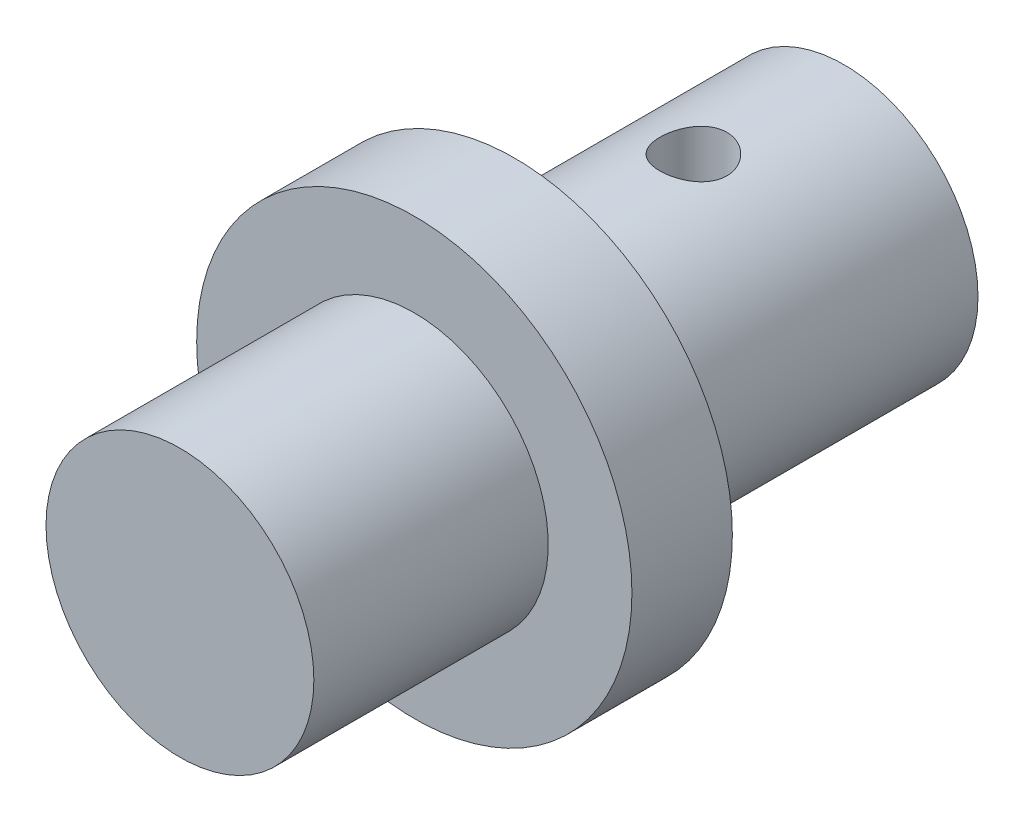
ISO-10303-21;
HEADER;
FILE_DESCRIPTION(('STEP AP214'),'2;1');
FILE_NAME('part.step','',(''),(''),'','','');
FILE_SCHEMA(('AUTOMOTIVE_DESIGN { 1 0 10303 214 1 1 1 1 }'));
ENDSEC;
DATA;
#1=APPLICATION_CONTEXT('core data for automotive mechanical design processes');
#2=APPLICATION_PROTOCOL_DEFINITION('international standard','automotive_design',2000,#1);
#3=PRODUCT_CONTEXT('',#1,'mechanical');
#4=PRODUCT('Part','Part','',(#3));
#5=PRODUCT_RELATED_PRODUCT_CATEGORY('part','',(#4));
#6=PRODUCT_DEFINITION_FORMATION('','',#4);
#7=PRODUCT_DEFINITION_CONTEXT('part definition',#1,'design');
#8=PRODUCT_DEFINITION('design','',#6,#7);
#9=PRODUCT_DEFINITION_SHAPE('','',#8);
#10=(LENGTH_UNIT() NAMED_UNIT(*) SI_UNIT(.MILLI.,.METRE.));
#11=(NAMED_UNIT(*) PLANE_ANGLE_UNIT() SI_UNIT($,.RADIAN.));
#12=(NAMED_UNIT(*) SI_UNIT($,.STERADIAN.) SOLID_ANGLE_UNIT());
#13=UNCERTAINTY_MEASURE_WITH_UNIT(LENGTH_MEASURE(1.E-05),#10,'distance_accuracy_value','');
#14=(GEOMETRIC_REPRESENTATION_CONTEXT(3) GLOBAL_UNCERTAINTY_ASSIGNED_CONTEXT((#13)) GLOBAL_UNIT_ASSIGNED_CONTEXT((#10,
#11,#12)) REPRESENTATION_CONTEXT('',''));
#15=CARTESIAN_POINT('',(0.,0.,0.));
#16=DIRECTION('',(0.,0.,1.));
#17=DIRECTION('',(1.,0.,0.));
#18=AXIS2_PLACEMENT_3D('',#15,#16,#17);
#19=CARTESIAN_POINT('',(0.,4.,4.5));
#20=DIRECTION('',(0.,-1.,0.));
#21=DIRECTION('',(0.,0.,-1.));
#22=AXIS2_PLACEMENT_3D('',#19,#20,#21);
#23=CYLINDRICAL_SURFACE('',#22,1.);
#24=CARTESIAN_POINT('',(0.,4.,3.5));
#25=CARTESIAN_POINT('',(0.0552507257798207,3.99999906578675,3.50000155049211));
#26=CARTESIAN_POINT('',(0.110518771887175,3.99884385421219,3.50459436718253));
#27=CARTESIAN_POINT('',(0.219470882513688,3.99434742553262,3.522816767538));
#28=CARTESIAN_POINT('',(0.273154031247159,3.99100496946646,3.53645147302523));
#29=CARTESIAN_POINT('',(0.377347248121718,3.98250417554693,3.57229283564139));
#30=CARTESIAN_POINT('',(0.427861042286669,3.97734801894725,3.59448919914352));
#31=CARTESIAN_POINT('',(0.524448087936284,3.96576895871729,3.64678759336322));
#32=CARTESIAN_POINT('',(0.570521189565839,3.95934601236034,3.67688989074596));
#33=CARTESIAN_POINT('',(0.657867951533946,3.94578275727868,3.74480052643614));
#34=CARTESIAN_POINT('',(0.69903712670738,3.93863138099022,3.78274104997278));
#35=CARTESIAN_POINT('',(0.774499284802202,3.92449080078353,3.86496813660594));
#36=CARTESIAN_POINT('',(0.808791491299423,3.91750161525566,3.90925541529766));
#37=CARTESIAN_POINT('',(0.870017695199355,3.9043651713314,4.00373015115829));
#38=CARTESIAN_POINT('',(0.896834810616904,3.89823196313737,4.05399548720694));
#39=CARTESIAN_POINT('',(0.941597939033685,3.88766329874815,4.15849894110557));
#40=CARTESIAN_POINT('',(0.959545370292888,3.88322757115193,4.21273642221717));
#41=CARTESIAN_POINT('',(0.985703224536193,3.87666984478367,4.32249566546832));
#42=CARTESIAN_POINT('',(0.994101512222225,3.87450327383617,4.37796993069987));
#43=CARTESIAN_POINT('',(1.00150785004523,3.87259575025161,4.48957904600932));
#44=CARTESIAN_POINT('',(1.00051742787865,3.87285440299096,4.54571378713241));
#45=CARTESIAN_POINT('',(0.98932434975952,3.87572803664412,4.65561053849632));
#46=CARTESIAN_POINT('',(0.979345560127013,3.87828575334586,4.70939708097673));
#47=CARTESIAN_POINT('',(0.950816124602071,3.88537806450989,4.8145073672742));
#48=CARTESIAN_POINT('',(0.932264868046282,3.88991279980464,4.86583093535266));
#49=CARTESIAN_POINT('',(0.886926318624769,3.90050075936124,4.96515867750138));
#50=CARTESIAN_POINT('',(0.860057778155274,3.90656884979614,5.01312411452637));
#51=CARTESIAN_POINT('',(0.798904184009969,3.91953140564257,5.10394580650456));
#52=CARTESIAN_POINT('',(0.764617832539226,3.9264260155649,5.14680116537817));
#53=CARTESIAN_POINT('',(0.688442283120812,3.94050587026521,5.2274690771296));
#54=CARTESIAN_POINT('',(0.646364172110573,3.94769379651981,5.26510299337423));
#55=CARTESIAN_POINT('',(0.556407945002467,3.96137310385857,5.3328141616426));
#56=CARTESIAN_POINT('',(0.508529651805296,3.96786446366277,5.36289118284238));
#57=CARTESIAN_POINT('',(0.408077259120928,3.97945154729455,5.41470039081626));
#58=CARTESIAN_POINT('',(0.355487595472416,3.9845424008515,5.43640356016962));
#59=CARTESIAN_POINT('',(0.247250672095255,3.99271944660946,5.47061153713971));
#60=CARTESIAN_POINT('',(0.191603999433656,3.99580602226187,5.48311810427876));
#61=CARTESIAN_POINT('',(0.0803599802600179,3.9995699951425,5.49830504370589));
#62=CARTESIAN_POINT('',(0.0247978133254731,4.00030702338852,5.5012286840502));
#63=CARTESIAN_POINT('',(-0.0860219165343387,3.99945869876301,5.49783399862967));
#64=CARTESIAN_POINT('',(-0.14127950642973,3.99787355494564,5.49151650480058));
#65=CARTESIAN_POINT('',(-0.249076179184328,3.99259720751571,5.47001939440575));
#66=CARTESIAN_POINT('',(-0.301643412645836,3.98893756123874,5.45497249101534));
#67=CARTESIAN_POINT('',(-0.403504861635007,3.97992471089423,5.41659527731437));
#68=CARTESIAN_POINT('',(-0.452798746021756,3.97457133579928,5.39326413045789));
#69=CARTESIAN_POINT('',(-0.547682089619898,3.96262205284207,5.33850924741685));
#70=CARTESIAN_POINT('',(-0.59319029455722,3.95600578244622,5.30694925840216));
#71=CARTESIAN_POINT('',(-0.678351075762164,3.94229672791613,5.23680672746869));
#72=CARTESIAN_POINT('',(-0.718002639315339,3.93520386167803,5.19822297358873));
#73=CARTESIAN_POINT('',(-0.79132704538182,3.92112637973847,5.11399869277036));
#74=CARTESIAN_POINT('',(-0.824829245081354,3.91414869458187,5.06820819799839));
#75=CARTESIAN_POINT('',(-0.883673839341798,3.90128585584826,4.97151157702286));
#76=CARTESIAN_POINT('',(-0.909016596105291,3.89540065378017,4.92060567802683));
#77=CARTESIAN_POINT('',(-0.950634280406194,3.88545396489777,4.81539618505795));
#78=CARTESIAN_POINT('',(-0.96696293110271,3.88138170194604,4.76111491443733));
#79=CARTESIAN_POINT('',(-0.990230439969186,3.87551162726789,4.65046024140726));
#80=CARTESIAN_POINT('',(-0.997171351652438,3.87371331813291,4.59408729931167));
#81=CARTESIAN_POINT('',(-1.00135906022266,3.87263267469305,4.48258598409653));
#82=CARTESIAN_POINT('',(-0.998878598520078,3.87327955152176,4.42746837658351));
#83=CARTESIAN_POINT('',(-0.984918185541911,3.87685272671895,4.31846407422135));
#84=CARTESIAN_POINT('',(-0.973438415124513,3.87977897927905,4.26457735465757));
#85=CARTESIAN_POINT('',(-0.941954212961863,3.88754173788482,4.15986102728973));
#86=CARTESIAN_POINT('',(-0.922000936453584,3.89236676824206,4.10901512983986));
#87=CARTESIAN_POINT('',(-0.874176609070047,3.90338503816552,4.01135641152421));
#88=CARTESIAN_POINT('',(-0.846304460022792,3.90957846747182,3.96454415120872));
#89=CARTESIAN_POINT('',(-0.782578499091424,3.92283756175675,3.87496358066532));
#90=CARTESIAN_POINT('',(-0.746535441941503,3.92992176554505,3.83233261771736));
#91=CARTESIAN_POINT('',(-0.667859580793157,3.94405351497524,3.75363530346973));
#92=CARTESIAN_POINT('',(-0.625225214174097,3.95110105151373,3.71757051325802));
#93=CARTESIAN_POINT('',(-0.533645057801727,3.96451770431775,3.65239246095693));
#94=CARTESIAN_POINT('',(-0.484598948210925,3.97087222243912,3.62341692421895));
#95=CARTESIAN_POINT('',(-0.382177373006984,3.98203283316746,3.57416835803965));
#96=CARTESIAN_POINT('',(-0.32880504229116,3.98684003466521,3.55388909290098));
#97=CARTESIAN_POINT('',(-0.229606835495648,3.99365373043694,3.52561877978023));
#98=CARTESIAN_POINT('',(-0.184253447272046,3.9960172336846,3.51603250463104));
#99=CARTESIAN_POINT('',(-0.0926040476908553,3.99919070154632,3.50322270425204));
#100=CARTESIAN_POINT('',(-0.0463081074950775,4.00000078300596,3.49999870046313));
#101=CARTESIAN_POINT('',(0.,4.,3.5));
#102=B_SPLINE_CURVE_WITH_KNOTS('',3,(#24,#25,#26,#27,#28,#29,#30,#31,#32,#33,#34,#35,#36,#37,
#38,#39,#40,#41,#42,#43,#44,#45,#46,#47,#48,#49,#50,#51,#52,#53,#54,#55,#56,#57,#58,#59,#60,#61,
#62,#63,#64,#65,#66,#67,#68,#69,#70,#71,#72,#73,#74,#75,#76,#77,#78,#79,#80,#81,#82,#83,#84,#85,
#86,#87,#88,#89,#90,#91,#92,#93,#94,#95,#96,#97,#98,#99,#100,#101),.UNSPECIFIED.,.T.,.F.,(4,2,2,
2,2,2,2,2,2,2,2,2,2,2,2,2,2,2,2,2,2,2,2,2,2,2,2,2,2,2,2,2,2,2,2,2,2,2,4),(0.,0.16558247498126,
0.331258825175933,0.49673660152407,0.662219960112885,0.830762902914259,0.999324863867079,
1.17039098363871,1.34142974112912,1.50904196732954,1.67662692075131,1.84014998004679,
2.00368468977359,2.16887018582586,2.33408460557442,2.50401000646013,2.67394059705498,
2.84445486006076,3.01493649125762,3.18105539299517,3.34715934075162,3.51080183009358,
3.67446084881527,3.84102391710235,4.00761575338679,4.17829672802984,4.34897012499672,
4.51861503076024,4.68822282168272,4.85295853599075,5.01769093970689,5.18144267039631,
5.34521712091267,5.51326384273273,5.68135046513612,5.85248123666392,6.02348909214233,
6.16228161961433,6.3010637069536),.UNSPECIFIED.);
#103=CARTESIAN_POINT('',(0.,4.,3.5));
#104=VERTEX_POINT('',#103);
#105=EDGE_CURVE('E43',#104,#104,#102,.T.);
#106=ORIENTED_EDGE('',*,*,#105,.F.);
#107=EDGE_LOOP('',(#106));
#108=FACE_BOUND('',#107,.T.);
#109=CARTESIAN_POINT('',(0.,-1.41480546000001,4.5));
#110=DIRECTION('',(0.,-1.,0.));
#111=DIRECTION('',(0.,0.,-1.));
#112=AXIS2_PLACEMENT_3D('',#109,#110,#111);
#113=CIRCLE('',#112,1.);
#114=CARTESIAN_POINT('',(0.,-1.41480546000001,3.5));
#115=VERTEX_POINT('',#114);
#116=EDGE_CURVE('E54',#115,#115,#113,.F.);
#117=ORIENTED_EDGE('',*,*,#116,.F.);
#118=EDGE_LOOP('',(#117));
#119=FACE_BOUND('',#118,.T.);
#120=ADVANCED_FACE('F31',(#108,#119),#23,.F.);
#121=CARTESIAN_POINT('',(0.,0.,19.83582727));
#122=DIRECTION('',(0.,0.,-1.));
#123=DIRECTION('',(-1.,0.,0.));
#124=AXIS2_PLACEMENT_3D('',#121,#122,#123);
#125=CYLINDRICAL_SURFACE('',#124,4.);
#126=CARTESIAN_POINT('',(0.,0.,9.8359246));
#127=DIRECTION('',(0.,0.,-1.));
#128=DIRECTION('',(-1.,0.,0.));
#129=AXIS2_PLACEMENT_3D('',#126,#127,#128);
#130=CIRCLE('',#129,4.);
#131=CARTESIAN_POINT('',(-4.,0.,9.8359246));
#132=VERTEX_POINT('',#131);
#133=EDGE_CURVE('E85',#132,#132,#130,.T.);
#134=ORIENTED_EDGE('',*,*,#133,.T.);
#135=EDGE_LOOP('',(#134));
#136=FACE_BOUND('',#135,.T.);
#137=ORIENTED_EDGE('',*,*,#105,.T.);
#138=EDGE_LOOP('',(#137));
#139=FACE_BOUND('',#138,.T.);
#140=CARTESIAN_POINT('',(0.,-4.,2.025));
#141=CARTESIAN_POINT('',(-0.125962527983466,-3.99999087743957,2.02500999117475));
#142=CARTESIAN_POINT('',(-0.252093477389554,-3.99398651152791,2.0346826713579));
#143=CARTESIAN_POINT('',(-0.500503164275012,-3.97053472893242,2.07286410529595));
#144=CARTESIAN_POINT('',(-0.622773463847888,-3.95306385098865,2.10141147883811));
#145=CARTESIAN_POINT('',(-0.859370702824245,-3.9084403936745,2.17569226660762));
#146=CARTESIAN_POINT('',(-0.973733723894938,-3.88133581279877,2.22134053797876));
#147=CARTESIAN_POINT('',(-1.19279008728619,-3.81971441235423,2.32796574414736));
#148=CARTESIAN_POINT('',(-1.29748482045069,-3.78519866131168,2.38894046942637));
#149=CARTESIAN_POINT('',(-1.50359316394966,-3.70840070972002,2.52981547687476));
#150=CARTESIAN_POINT('',(-1.60409343471206,-3.66572028722713,2.61083067728701));
#151=CARTESIAN_POINT('',(-1.79096791104175,-3.57814322130472,2.78693966351467));
#152=CARTESIAN_POINT('',(-1.87732302390648,-3.53324368721205,2.88205215309908));
#153=CARTESIAN_POINT('',(-2.04506363595458,-3.43920352816993,3.09839915716578));
#154=CARTESIAN_POINT('',(-2.12428336464637,-3.39028681581553,3.2214247225928));
#155=CARTESIAN_POINT('',(-2.26067210059697,-3.30091378437148,3.48191121203256));
#156=CARTESIAN_POINT('',(-2.31787803738444,-3.26044334879098,3.61934746386028));
#157=CARTESIAN_POINT('',(-2.39585473139489,-3.20337240494684,3.8691356997232));
#158=CARTESIAN_POINT('',(-2.42219544007388,-3.1833171910417,3.9789548259248));
#159=CARTESIAN_POINT('',(-2.45966467236897,-3.15446174060793,4.20254536292264));
#160=CARTESIAN_POINT('',(-2.47081401370517,-3.14564610282378,4.31631114553434));
#161=CARTESIAN_POINT('',(-2.47723878292226,-3.14059073236661,4.54485948967856));
#162=CARTESIAN_POINT('',(-2.47247541860744,-3.14438173221214,4.65964385464637));
#163=CARTESIAN_POINT('',(-2.44730787139391,-3.16400414319883,4.88646273709323));
#164=CARTESIAN_POINT('',(-2.42689132982624,-3.17984506805208,4.99849500954426));
#165=CARTESIAN_POINT('',(-2.37213044836685,-3.22088858685475,5.21472152758653));
#166=CARTESIAN_POINT('',(-2.33807543860679,-3.24589584332613,5.31902831079517));
#167=CARTESIAN_POINT('',(-2.25735449417097,-3.30254089772638,5.52067920505908));
#168=CARTESIAN_POINT('',(-2.21068406332192,-3.33418105873783,5.61802081803367));
#169=CARTESIAN_POINT('',(-2.09618724882258,-3.4075536569795,5.8220096916399));
#170=CARTESIAN_POINT('',(-2.02604859807342,-3.4500720013296,5.92707594903287));
#171=CARTESIAN_POINT('',(-1.87097625783654,-3.5365722083175,6.12508677574881));
#172=CARTESIAN_POINT('',(-1.78602759503902,-3.58055551531127,6.21801890923623));
#173=CARTESIAN_POINT('',(-1.5878717295625,-3.67320631262343,6.40409400372712));
#174=CARTESIAN_POINT('',(-1.47231994534046,-3.72151331309376,6.49494212146241));
#175=CARTESIAN_POINT('',(-1.22463392606212,-3.81018237230542,6.65583369602293));
#176=CARTESIAN_POINT('',(-1.09250692637344,-3.85054787802005,6.72588618585416));
#177=CARTESIAN_POINT('',(-0.888459599267787,-3.90066898053568,6.81112906855973));
#178=CARTESIAN_POINT('',(-0.821558567010723,-3.91533736056855,6.83576351071682));
#179=CARTESIAN_POINT('',(-0.685323525177254,-3.9414626480525,6.87929814010671));
#180=CARTESIAN_POINT('',(-0.615990935724851,-3.95292139603236,6.89820161421545));
#181=CARTESIAN_POINT('',(-0.475522335069477,-3.97226622387952,6.92995525913055));
#182=CARTESIAN_POINT('',(-0.404387917801591,-3.98015535245198,6.942810595845));
#183=CARTESIAN_POINT('',(-0.260979278185191,-3.99212703659955,6.96226702757636));
#184=CARTESIAN_POINT('',(-0.188705243355633,-3.99621021191558,6.9688691408373));
#185=CARTESIAN_POINT('',(0.00763946573205035,-4.00190143559954,6.97808067068138));
#186=CARTESIAN_POINT('',(0.132185245919001,-3.99971548719424,6.97456216445741));
#187=CARTESIAN_POINT('',(0.378536132806585,-3.98396559799443,6.94902023765427));
#188=CARTESIAN_POINT('',(0.500341388449554,-3.97040227707988,6.92699782523398));
#189=CARTESIAN_POINT('',(0.733654769687328,-3.93385420950478,6.86672428138281));
#190=CARTESIAN_POINT('',(0.845374410705363,-3.9112177702641,6.82907146088568));
#191=CARTESIAN_POINT('',(1.06081280901474,-3.85836717943891,6.73918316087296));
#192=CARTESIAN_POINT('',(1.16453016966602,-3.82815170897843,6.68694514311424));
#193=CARTESIAN_POINT('',(1.37248771563005,-3.75891970655208,6.56348760466114));
#194=CARTESIAN_POINT('',(1.47570454043898,-3.7193201336696,6.49087641916675));
#195=CARTESIAN_POINT('',(1.66922989951576,-3.63658820064071,6.33167343924813));
#196=CARTESIAN_POINT('',(1.75952362643114,-3.5934518756442,6.2450658456942));
#197=CARTESIAN_POINT('',(1.93787932608623,-3.50086864723262,6.04613856720843));
#198=CARTESIAN_POINT('',(2.02381364296441,-3.45139332825516,5.93191452993249));
#199=CARTESIAN_POINT('',(2.17552687073637,-3.35783124116785,5.68877990197333));
#200=CARTESIAN_POINT('',(2.24132174040988,-3.31374022320296,5.55988105152722));
#201=CARTESIAN_POINT('',(2.33866031431269,-3.24552450103664,5.31820954206094));
#202=CARTESIAN_POINT('',(2.37450880315115,-3.21914844080678,5.20781513777796));
#203=CARTESIAN_POINT('',(2.43055921939533,-3.17704740009971,4.98122708806866));
#204=CARTESIAN_POINT('',(2.45078500797716,-3.16130618123091,4.86504257621622));
#205=CARTESIAN_POINT('',(2.47447017579692,-3.14280847463082,4.62928686080161));
#206=CARTESIAN_POINT('',(2.47784252968112,-3.14011938566789,4.50970127898103));
#207=CARTESIAN_POINT('',(2.46733028166308,-3.14838328658991,4.27174467214502));
#208=CARTESIAN_POINT('',(2.45343876177927,-3.15934174532553,4.15337415319893));
#209=CARTESIAN_POINT('',(2.41094588125371,-3.19186055123113,3.9299308355747));
#210=CARTESIAN_POINT('',(2.38347497612073,-3.21260123970755,3.82451408447668));
#211=CARTESIAN_POINT('',(2.31571505122842,-3.26178005148025,3.61981464655905));
#212=CARTESIAN_POINT('',(2.2754208911378,-3.29022126092472,3.52053443872701));
#213=CARTESIAN_POINT('',(2.17636069333138,-3.35671073710027,3.31512067439187));
#214=CARTESIAN_POINT('',(2.11574500484257,-3.39555758321937,3.21014201676092));
#215=CARTESIAN_POINT('',(1.98052353535903,-3.47616593124867,3.01081425043567));
#216=CARTESIAN_POINT('',(1.90590627255023,-3.51792980746062,2.91647396798373));
#217=CARTESIAN_POINT('',(1.72831892230952,-3.60897029465697,2.72265900985432));
#218=CARTESIAN_POINT('',(1.62265550005684,-3.65817091722733,2.62559878309527));
#219=CARTESIAN_POINT('',(1.39440586406054,-3.75110304686878,2.4501381433884));
#220=CARTESIAN_POINT('',(1.27181044397131,-3.79483155379204,2.37174794540267));
#221=CARTESIAN_POINT('',(1.07769660125097,-3.85267715311657,2.27076526640258));
#222=CARTESIAN_POINT('',(1.0114941134209,-3.87062708690963,2.23993674263541));
#223=CARTESIAN_POINT('',(0.875994766807381,-3.90352146722193,2.18405126684023));
#224=CARTESIAN_POINT('',(0.806699728679913,-3.91846765432095,2.15899097106909));
#225=CARTESIAN_POINT('',(0.665740924017364,-3.9448597933727,2.11507858550998));
#226=CARTESIAN_POINT('',(0.594084303316355,-3.95631539176473,2.09620937500367));
#227=CARTESIAN_POINT('',(0.448918256542058,-3.97540230806529,2.06492240314493));
#228=CARTESIAN_POINT('',(0.375410287472423,-3.98303654032878,2.05249972509498));
#229=CARTESIAN_POINT('',(0.251466042875674,-3.99240148909702,2.03729477431933));
#230=CARTESIAN_POINT('',(0.201329660865054,-3.9952457549138,2.03268939813245));
#231=CARTESIAN_POINT('',(0.100804522670094,-3.99904689272888,2.02653991949148));
#232=CARTESIAN_POINT('',(0.050415751494715,-4.00000365125047,2.02499600109182));
#233=CARTESIAN_POINT('',(0.,-4.,2.025));
#234=B_SPLINE_CURVE_WITH_KNOTS('',3,(#140,#141,#142,#143,#144,#145,#146,#147,#148,#149,#150,
#151,#152,#153,#154,#155,#156,#157,#158,#159,#160,#161,#162,#163,#164,#165,#166,#167,#168,#169,
#170,#171,#172,#173,#174,#175,#176,#177,#178,#179,#180,#181,#182,#183,#184,#185,#186,#187,#188,
#189,#190,#191,#192,#193,#194,#195,#196,#197,#198,#199,#200,#201,#202,#203,#204,#205,#206,#207,
#208,#209,#210,#211,#212,#213,#214,#215,#216,#217,#218,#219,#220,#221,#222,#223,#224,#225,#226,
#227,#228,#229,#230,#231,#232,#233),.UNSPECIFIED.,.T.,.F.,(4,2,2,2,2,2,2,2,2,2,2,2,2,2,2,2,2,2,
2,2,2,2,2,2,2,2,2,2,2,2,2,2,2,2,2,2,2,2,2,2,2,2,2,2,2,2,4),(0.,0.377684595134566,
0.756144377751363,1.13274438066485,1.50929012263231,1.91559686196039,2.32244758143944,
2.78307771811007,3.24293171444895,3.58559905838162,3.92779634905329,4.27082846078721,
4.61413168627068,4.95050814914346,5.28700465601145,5.68538662170093,6.08417372279124,
6.5460811923014,7.00778772829047,7.2258674081596,7.44382177537447,7.66158964128115,
7.87932204084382,8.25107334700639,8.62280440014348,8.98145525863934,9.34016857162815,
9.73542912792464,10.1311390109841,10.5828984857517,11.0342990476809,11.3899584472683,
11.7450735539492,12.1020204721279,12.4591104722506,12.7905042391701,13.1220310163142,
13.502543646692,13.8833696861889,14.3363576994623,14.7895929903258,15.0149141754891,
15.2401044150058,15.4646665631763,15.6890571876744,15.8402141098361,15.9913801192558),.UNSPECIFIED.);
#235=CARTESIAN_POINT('',(0.,-4.,2.025));
#236=VERTEX_POINT('',#235);
#237=EDGE_CURVE('E39',#236,#236,#234,.T.);
#238=ORIENTED_EDGE('',*,*,#237,.T.);
#239=EDGE_LOOP('',(#238));
#240=FACE_BOUND('',#239,.T.);
#241=CARTESIAN_POINT('',(0.,0.,0.));
#242=DIRECTION('',(0.,0.,1.));
#243=DIRECTION('',(1.,0.,0.));
#244=AXIS2_PLACEMENT_3D('',#241,#242,#243);
#245=CIRCLE('',#244,4.);
#246=CARTESIAN_POINT('',(4.,0.,0.));
#247=VERTEX_POINT('',#246);
#248=EDGE_CURVE('E73',#247,#247,#245,.T.);
#249=ORIENTED_EDGE('',*,*,#248,.T.);
#250=EDGE_LOOP('',(#249));
#251=FACE_BOUND('',#250,.T.);
#252=ADVANCED_FACE('F33',(#136,#139,#240,#251),#125,.T.);
#253=CARTESIAN_POINT('',(0.,0.,0.));
#254=DIRECTION('',(0.,0.,1.));
#255=DIRECTION('',(1.,0.,0.));
#256=AXIS2_PLACEMENT_3D('',#253,#254,#255);
#257=PLANE('',#256);
#258=ORIENTED_EDGE('',*,*,#248,.F.);
#259=EDGE_LOOP('',(#258));
#260=FACE_BOUND('',#259,.T.);
#261=ADVANCED_FACE('F61',(#260),#257,.F.);
#262=CARTESIAN_POINT('',(0.,-1.41480546000001,4.5));
#263=DIRECTION('',(0.,-1.,0.));
#264=DIRECTION('',(0.,0.,-1.));
#265=AXIS2_PLACEMENT_3D('',#262,#263,#264);
#266=CYLINDRICAL_SURFACE('',#265,2.475);
#267=CARTESIAN_POINT('',(0.,-1.41480546000001,4.5));
#268=DIRECTION('',(0.,-1.,0.));
#269=DIRECTION('',(0.,0.,-1.));
#270=AXIS2_PLACEMENT_3D('',#267,#268,#269);
#271=CIRCLE('',#270,2.475);
#272=CARTESIAN_POINT('',(0.,-1.41480546000001,2.025));
#273=VERTEX_POINT('',#272);
#274=EDGE_CURVE('E78',#273,#273,#271,.T.);
#275=ORIENTED_EDGE('',*,*,#274,.F.);
#276=EDGE_LOOP('',(#275));
#277=FACE_BOUND('',#276,.T.);
#278=ORIENTED_EDGE('',*,*,#237,.F.);
#279=EDGE_LOOP('',(#278));
#280=FACE_BOUND('',#279,.T.);
#281=ADVANCED_FACE('F55',(#277,#280),#266,.F.);
#282=CARTESIAN_POINT('',(0.,-1.41480546000001,4.5));
#283=DIRECTION('',(0.,-1.,0.));
#284=DIRECTION('',(0.,0.,-1.));
#285=AXIS2_PLACEMENT_3D('',#282,#283,#284);
#286=PLANE('',#285);
#287=ORIENTED_EDGE('',*,*,#274,.T.);
#288=EDGE_LOOP('',(#287));
#289=FACE_BOUND('',#288,.T.);
#290=ORIENTED_EDGE('',*,*,#116,.T.);
#291=EDGE_LOOP('',(#290));
#292=FACE_BOUND('',#291,.T.);
#293=ADVANCED_FACE('F60',(#289,#292),#286,.T.);
#294=CARTESIAN_POINT('',(0.,0.,9.8359246));
#295=DIRECTION('',(0.,0.,-1.));
#296=DIRECTION('',(-1.,0.,0.));
#297=AXIS2_PLACEMENT_3D('',#294,#295,#296);
#298=PLANE('',#297);
#299=CARTESIAN_POINT('',(0.,0.,9.8359246));
#300=DIRECTION('',(0.,0.,-1.));
#301=DIRECTION('',(-1.,0.,0.));
#302=AXIS2_PLACEMENT_3D('',#299,#300,#301);
#303=CIRCLE('',#302,6.5);
#304=CARTESIAN_POINT('',(-6.5,0.,9.8359246));
#305=VERTEX_POINT('',#304);
#306=EDGE_CURVE('E81',#305,#305,#303,.T.);
#307=ORIENTED_EDGE('',*,*,#306,.T.);
#308=EDGE_LOOP('',(#307));
#309=FACE_BOUND('',#308,.T.);
#310=ORIENTED_EDGE('',*,*,#133,.F.);
#311=EDGE_LOOP('',(#310));
#312=FACE_BOUND('',#311,.T.);
#313=ADVANCED_FACE('F93',(#309,#312),#298,.T.);
#314=CARTESIAN_POINT('',(0.,0.,12.8359246));
#315=DIRECTION('',(0.,0.,-1.));
#316=DIRECTION('',(-1.,0.,0.));
#317=AXIS2_PLACEMENT_3D('',#314,#315,#316);
#318=PLANE('',#317);
#319=CARTESIAN_POINT('',(0.,0.,12.8359246));
#320=DIRECTION('',(0.,0.,-1.));
#321=DIRECTION('',(-1.,0.,0.));
#322=AXIS2_PLACEMENT_3D('',#319,#320,#321);
#323=CIRCLE('',#322,6.5);
#324=CARTESIAN_POINT('',(-6.5,0.,12.8359246));
#325=VERTEX_POINT('',#324);
#326=EDGE_CURVE('E82',#325,#325,#323,.T.);
#327=ORIENTED_EDGE('',*,*,#326,.F.);
#328=EDGE_LOOP('',(#327));
#329=FACE_BOUND('',#328,.T.);
#330=CARTESIAN_POINT('',(0.,0.,12.8359246));
#331=DIRECTION('',(0.,0.,-1.));
#332=DIRECTION('',(-1.,0.,0.));
#333=AXIS2_PLACEMENT_3D('',#330,#331,#332);
#334=CIRCLE('',#333,4.);
#335=CARTESIAN_POINT('',(-4.,0.,12.8359246));
#336=VERTEX_POINT('',#335);
#337=EDGE_CURVE('E10',#336,#336,#334,.T.);
#338=ORIENTED_EDGE('',*,*,#337,.T.);
#339=EDGE_LOOP('',(#338));
#340=FACE_BOUND('',#339,.T.);
#341=ADVANCED_FACE('F95',(#329,#340),#318,.F.);
#342=CARTESIAN_POINT('',(0.,0.,9.8359246));
#343=DIRECTION('',(0.,0.,1.));
#344=DIRECTION('',(1.,0.,0.));
#345=AXIS2_PLACEMENT_3D('',#342,#343,#344);
#346=CYLINDRICAL_SURFACE('',#345,6.5);
#347=ORIENTED_EDGE('',*,*,#306,.F.);
#348=EDGE_LOOP('',(#347));
#349=FACE_BOUND('',#348,.T.);
#350=ORIENTED_EDGE('',*,*,#326,.T.);
#351=EDGE_LOOP('',(#350));
#352=FACE_BOUND('',#351,.T.);
#353=ADVANCED_FACE('F102',(#349,#352),#346,.T.);
#354=CARTESIAN_POINT('',(0.,0.,19.83582727));
#355=DIRECTION('',(0.,0.,1.));
#356=DIRECTION('',(1.,0.,0.));
#357=AXIS2_PLACEMENT_3D('',#354,#355,#356);
#358=PLANE('',#357);
#359=CARTESIAN_POINT('',(0.,0.,19.83582727));
#360=DIRECTION('',(0.,0.,1.));
#361=DIRECTION('',(1.,0.,0.));
#362=AXIS2_PLACEMENT_3D('',#359,#360,#361);
#363=CIRCLE('',#362,4.);
#364=CARTESIAN_POINT('',(4.,0.,19.83582727));
#365=VERTEX_POINT('',#364);
#366=EDGE_CURVE('E47',#365,#365,#363,.T.);
#367=ORIENTED_EDGE('',*,*,#366,.T.);
#368=EDGE_LOOP('',(#367));
#369=FACE_BOUND('',#368,.T.);
#370=ADVANCED_FACE('F68',(#369),#358,.T.);
#371=ORIENTED_EDGE('',*,*,#366,.F.);
#372=EDGE_LOOP('',(#371));
#373=FACE_BOUND('',#372,.T.);
#374=ORIENTED_EDGE('',*,*,#337,.F.);
#375=EDGE_LOOP('',(#374));
#376=FACE_BOUND('',#375,.T.);
#377=ADVANCED_FACE('F112',(#373,#376),#125,.T.);
#378=CLOSED_SHELL('',(#120,#252,#261,#281,#293,#313,#341,#353,#370,#377));
#379=MANIFOLD_SOLID_BREP('B2',#378);
#380=ADVANCED_BREP_SHAPE_REPRESENTATION('',(#18,#379),#14);
#381=SHAPE_DEFINITION_REPRESENTATION(#9,#380);
ENDSEC;
END-ISO-10303-21;
